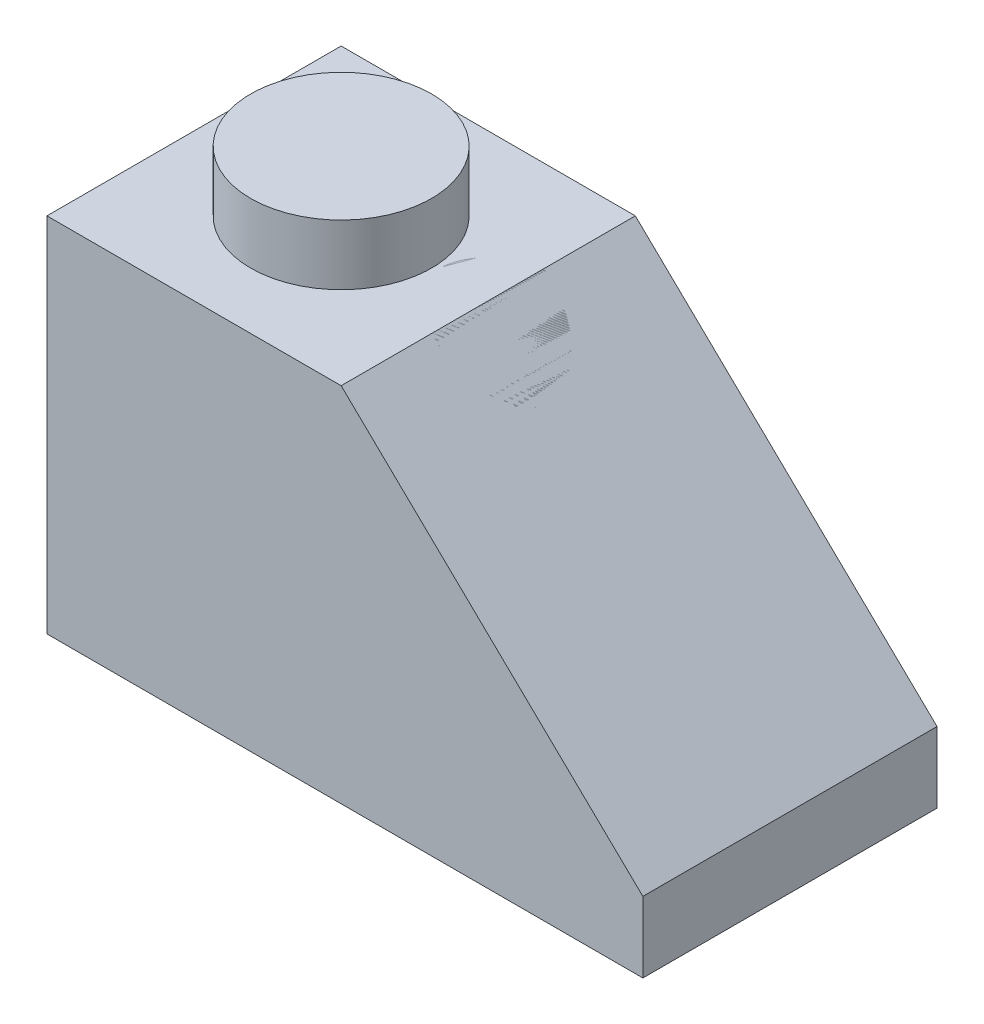
ISO-10303-21;
HEADER;
FILE_DESCRIPTION(('STEP AP214'),'2;1');
FILE_NAME('part.step','',(''),(''),'','','');
FILE_SCHEMA(('AUTOMOTIVE_DESIGN { 1 0 10303 214 1 1 1 1 }'));
ENDSEC;
DATA;
#1=APPLICATION_CONTEXT('core data for automotive mechanical design processes');
#2=APPLICATION_PROTOCOL_DEFINITION('international standard','automotive_design',2000,#1);
#3=PRODUCT_CONTEXT('',#1,'mechanical');
#4=PRODUCT('Part','Part','',(#3));
#5=PRODUCT_RELATED_PRODUCT_CATEGORY('part','',(#4));
#6=PRODUCT_DEFINITION_FORMATION('','',#4);
#7=PRODUCT_DEFINITION_CONTEXT('part definition',#1,'design');
#8=PRODUCT_DEFINITION('design','',#6,#7);
#9=PRODUCT_DEFINITION_SHAPE('','',#8);
#10=(LENGTH_UNIT() NAMED_UNIT(*) SI_UNIT(.MILLI.,.METRE.));
#11=(NAMED_UNIT(*) PLANE_ANGLE_UNIT() SI_UNIT($,.RADIAN.));
#12=(NAMED_UNIT(*) SI_UNIT($,.STERADIAN.) SOLID_ANGLE_UNIT());
#13=UNCERTAINTY_MEASURE_WITH_UNIT(LENGTH_MEASURE(1.E-05),#10,'distance_accuracy_value','');
#14=(GEOMETRIC_REPRESENTATION_CONTEXT(3) GLOBAL_UNCERTAINTY_ASSIGNED_CONTEXT((#13)) GLOBAL_UNIT_ASSIGNED_CONTEXT((#10,
#11,#12)) REPRESENTATION_CONTEXT('',''));
#15=CARTESIAN_POINT('',(0.,0.,0.));
#16=DIRECTION('',(0.,0.,1.));
#17=DIRECTION('',(1.,0.,0.));
#18=AXIS2_PLACEMENT_3D('',#15,#16,#17);
#19=CARTESIAN_POINT('',(0.,9.6,-7.8));
#20=DIRECTION('',(0.,-1.,0.));
#21=DIRECTION('',(0.,0.,-1.));
#22=AXIS2_PLACEMENT_3D('',#19,#20,#21);
#23=PLANE('',#22);
#24=DIRECTION('',(0.,0.,1.));
#25=VECTOR('',#24,1.);
#26=CARTESIAN_POINT('',(7.8,9.6,-7.8));
#27=LINE('',#26,#25);
#28=CARTESIAN_POINT('',(7.8,9.6,-5.39666295470958));
#29=VERTEX_POINT('',#28);
#30=CARTESIAN_POINT('',(7.8,9.6,-2.40333704529042));
#31=VERTEX_POINT('',#30);
#32=EDGE_CURVE('E12',#29,#31,#27,.T.);
#33=ORIENTED_EDGE('',*,*,#32,.F.);
#34=CARTESIAN_POINT('',(7.9,9.6,-3.9));
#35=DIRECTION('',(0.,-1.,0.));
#36=DIRECTION('',(0.,0.,-1.));
#37=AXIS2_PLACEMENT_3D('',#34,#35,#36);
#38=CIRCLE('',#37,1.5);
#39=EDGE_CURVE('E51',#29,#31,#38,.F.);
#40=ORIENTED_EDGE('',*,*,#39,.T.);
#41=EDGE_LOOP('',(#33,#40));
#42=FACE_BOUND('',#41,.T.);
#43=ADVANCED_FACE('F47',(#42),#23,.F.);
#44=CARTESIAN_POINT('',(7.8,9.6,-7.8));
#45=DIRECTION('',(-0.694658370458999,-0.71933980033865,0.));
#46=DIRECTION('',(0.71933980033865,-0.694658370458999,0.));
#47=AXIS2_PLACEMENT_3D('',#44,#45,#46);
#48=PLANE('',#47);
#49=ORIENTED_EDGE('',*,*,#32,.T.);
#50=CARTESIAN_POINT('',(7.9,9.50343112251929,-3.9));
#51=DIRECTION('',(-0.694658370458999,-0.71933980033865,0.));
#52=DIRECTION('',(0.71933980033865,-0.694658370458999,0.));
#53=AXIS2_PLACEMENT_3D('',#50,#51,#52);
#54=ELLIPSE('',#53,2.08524538652502,1.5);
#55=EDGE_CURVE('E67',#31,#29,#54,.F.);
#56=ORIENTED_EDGE('',*,*,#55,.T.);
#57=EDGE_LOOP('',(#49,#56));
#58=FACE_BOUND('',#57,.T.);
#59=ADVANCED_FACE('F65',(#58),#48,.F.);
#60=CARTESIAN_POINT('',(7.9,9.602,-3.9));
#61=DIRECTION('',(0.,-1.,0.));
#62=DIRECTION('',(0.,0.,-1.));
#63=AXIS2_PLACEMENT_3D('',#60,#61,#62);
#64=CYLINDRICAL_SURFACE('',#63,1.5);
#65=ORIENTED_EDGE('',*,*,#55,.F.);
#66=ORIENTED_EDGE('',*,*,#39,.F.);
#67=EDGE_LOOP('',(#65,#66));
#68=FACE_BOUND('',#67,.T.);
#69=CARTESIAN_POINT('',(7.9,0.2,-3.9));
#70=DIRECTION('',(0.,-1.,0.));
#71=DIRECTION('',(0.,0.,-1.));
#72=AXIS2_PLACEMENT_3D('',#69,#70,#71);
#73=CIRCLE('',#72,1.5);
#74=CARTESIAN_POINT('',(7.9,0.2,-5.4));
#75=VERTEX_POINT('',#74);
#76=EDGE_CURVE('E56',#75,#75,#73,.T.);
#77=ORIENTED_EDGE('',*,*,#76,.F.);
#78=EDGE_LOOP('',(#77));
#79=FACE_BOUND('',#78,.T.);
#80=ADVANCED_FACE('F49',(#68,#79),#64,.T.);
#81=CARTESIAN_POINT('',(7.9,0.2,-3.9));
#82=DIRECTION('',(0.,-1.,0.));
#83=DIRECTION('',(0.,0.,-1.));
#84=AXIS2_PLACEMENT_3D('',#81,#82,#83);
#85=PLANE('',#84);
#86=ORIENTED_EDGE('',*,*,#76,.T.);
#87=EDGE_LOOP('',(#86));
#88=FACE_BOUND('',#87,.T.);
#89=ADVANCED_FACE('F74',(#88),#85,.T.);
#90=CLOSED_SHELL('',(#43,#59,#80,#89));
#91=MANIFOLD_SOLID_BREP('B2',#90);
#92=CARTESIAN_POINT('',(0.,0.,-7.8));
#93=DIRECTION('',(0.,-1.,0.));
#94=DIRECTION('',(0.,0.,-1.));
#95=AXIS2_PLACEMENT_3D('',#92,#93,#94);
#96=PLANE('',#95);
#97=DIRECTION('',(1.,0.,0.));
#98=VECTOR('',#97,1.);
#99=CARTESIAN_POINT('',(0.,0.,0.));
#100=LINE('',#99,#98);
#101=CARTESIAN_POINT('',(0.,0.,0.));
#102=VERTEX_POINT('',#101);
#103=CARTESIAN_POINT('',(15.8,0.,0.));
#104=VERTEX_POINT('',#103);
#105=EDGE_CURVE('E201',#102,#104,#100,.T.);
#106=ORIENTED_EDGE('',*,*,#105,.F.);
#107=DIRECTION('',(0.,0.,1.));
#108=VECTOR('',#107,1.);
#109=CARTESIAN_POINT('',(0.,0.,-7.8));
#110=LINE('',#109,#108);
#111=CARTESIAN_POINT('',(0.,0.,-7.8));
#112=VERTEX_POINT('',#111);
#113=EDGE_CURVE('E116',#112,#102,#110,.T.);
#114=ORIENTED_EDGE('',*,*,#113,.F.);
#115=DIRECTION('',(1.,0.,0.));
#116=VECTOR('',#115,1.);
#117=CARTESIAN_POINT('',(0.,0.,-7.8));
#118=LINE('',#117,#116);
#119=CARTESIAN_POINT('',(15.8,0.,-7.8));
#120=VERTEX_POINT('',#119);
#121=EDGE_CURVE('E196',#112,#120,#118,.T.);
#122=ORIENTED_EDGE('',*,*,#121,.T.);
#123=DIRECTION('',(0.,0.,1.));
#124=VECTOR('',#123,1.);
#125=CARTESIAN_POINT('',(15.8,0.,-7.8));
#126=LINE('',#125,#124);
#127=EDGE_CURVE('E111',#120,#104,#126,.T.);
#128=ORIENTED_EDGE('',*,*,#127,.T.);
#129=EDGE_LOOP('',(#106,#114,#122,#128));
#130=FACE_BOUND('',#129,.T.);
#131=DIRECTION('',(0.,0.,1.));
#132=VECTOR('',#131,1.);
#133=CARTESIAN_POINT('',(1.2,0.,-7.8));
#134=LINE('',#133,#132);
#135=CARTESIAN_POINT('',(1.2,0.,-6.6));
#136=VERTEX_POINT('',#135);
#137=CARTESIAN_POINT('',(1.2,0.,-1.2));
#138=VERTEX_POINT('',#137);
#139=EDGE_CURVE('E236',#136,#138,#134,.T.);
#140=ORIENTED_EDGE('',*,*,#139,.T.);
#141=DIRECTION('',(1.,0.,0.));
#142=VECTOR('',#141,1.);
#143=CARTESIAN_POINT('',(0.,0.,-1.2));
#144=LINE('',#143,#142);
#145=CARTESIAN_POINT('',(14.6,0.,-1.2));
#146=VERTEX_POINT('',#145);
#147=EDGE_CURVE('E223',#138,#146,#144,.T.);
#148=ORIENTED_EDGE('',*,*,#147,.T.);
#149=DIRECTION('',(0.,0.,1.));
#150=VECTOR('',#149,1.);
#151=CARTESIAN_POINT('',(14.6,0.,-7.8));
#152=LINE('',#151,#150);
#153=CARTESIAN_POINT('',(14.6,0.,-6.6));
#154=VERTEX_POINT('',#153);
#155=EDGE_CURVE('E228',#154,#146,#152,.T.);
#156=ORIENTED_EDGE('',*,*,#155,.F.);
#157=DIRECTION('',(1.,0.,0.));
#158=VECTOR('',#157,1.);
#159=CARTESIAN_POINT('',(0.,0.,-6.6));
#160=LINE('',#159,#158);
#161=EDGE_CURVE('E124',#136,#154,#160,.T.);
#162=ORIENTED_EDGE('',*,*,#161,.F.);
#163=EDGE_LOOP('',(#140,#148,#156,#162));
#164=FACE_BOUND('',#163,.T.);
#165=ADVANCED_FACE('F108',(#130,#164),#96,.T.);
#166=CARTESIAN_POINT('',(0.,0.,-7.8));
#167=DIRECTION('',(1.,0.,0.));
#168=DIRECTION('',(0.,0.,-1.));
#169=AXIS2_PLACEMENT_3D('',#166,#167,#168);
#170=PLANE('',#169);
#171=DIRECTION('',(0.,1.,0.));
#172=VECTOR('',#171,1.);
#173=CARTESIAN_POINT('',(0.,0.,0.));
#174=LINE('',#173,#172);
#175=CARTESIAN_POINT('',(0.,9.6,0.));
#176=VERTEX_POINT('',#175);
#177=EDGE_CURVE('E211',#102,#176,#174,.T.);
#178=ORIENTED_EDGE('',*,*,#177,.T.);
#179=DIRECTION('',(0.,0.,1.));
#180=VECTOR('',#179,1.);
#181=CARTESIAN_POINT('',(0.,9.6,-7.8));
#182=LINE('',#181,#180);
#183=CARTESIAN_POINT('',(0.,9.6,-7.8));
#184=VERTEX_POINT('',#183);
#185=EDGE_CURVE('E190',#184,#176,#182,.T.);
#186=ORIENTED_EDGE('',*,*,#185,.F.);
#187=DIRECTION('',(0.,1.,0.));
#188=VECTOR('',#187,1.);
#189=CARTESIAN_POINT('',(0.,0.,-7.8));
#190=LINE('',#189,#188);
#191=EDGE_CURVE('E177',#112,#184,#190,.T.);
#192=ORIENTED_EDGE('',*,*,#191,.F.);
#193=ORIENTED_EDGE('',*,*,#113,.T.);
#194=EDGE_LOOP('',(#178,#186,#192,#193));
#195=FACE_BOUND('',#194,.T.);
#196=ADVANCED_FACE('F218',(#195),#170,.F.);
#197=CARTESIAN_POINT('',(0.,9.6,-7.8));
#198=DIRECTION('',(0.,-1.,0.));
#199=DIRECTION('',(0.,0.,-1.));
#200=AXIS2_PLACEMENT_3D('',#197,#198,#199);
#201=PLANE('',#200);
#202=CARTESIAN_POINT('',(3.9,9.6,-3.9));
#203=DIRECTION('',(0.,1.,0.));
#204=DIRECTION('',(0.,0.,1.));
#205=AXIS2_PLACEMENT_3D('',#202,#203,#204);
#206=CIRCLE('',#205,2.4);
#207=CARTESIAN_POINT('',(3.9,9.6,-1.5));
#208=VERTEX_POINT('',#207);
#209=EDGE_CURVE('E45',#208,#208,#206,.T.);
#210=ORIENTED_EDGE('',*,*,#209,.F.);
#211=EDGE_LOOP('',(#210));
#212=FACE_BOUND('',#211,.T.);
#213=DIRECTION('',(1.,0.,0.));
#214=VECTOR('',#213,1.);
#215=CARTESIAN_POINT('',(0.,9.6,0.));
#216=LINE('',#215,#214);
#217=CARTESIAN_POINT('',(7.8,9.6,0.));
#218=VERTEX_POINT('',#217);
#219=EDGE_CURVE('E186',#176,#218,#216,.T.);
#220=ORIENTED_EDGE('',*,*,#219,.T.);
#221=DIRECTION('',(0.,0.,1.));
#222=VECTOR('',#221,1.);
#223=CARTESIAN_POINT('',(7.8,9.6,-7.8));
#224=LINE('',#223,#222);
#225=CARTESIAN_POINT('',(7.8,9.6,-7.8));
#226=VERTEX_POINT('',#225);
#227=EDGE_CURVE('E183',#226,#218,#224,.T.);
#228=ORIENTED_EDGE('',*,*,#227,.F.);
#229=DIRECTION('',(1.,0.,0.));
#230=VECTOR('',#229,1.);
#231=CARTESIAN_POINT('',(0.,9.6,-7.8));
#232=LINE('',#231,#230);
#233=EDGE_CURVE('E170',#184,#226,#232,.T.);
#234=ORIENTED_EDGE('',*,*,#233,.F.);
#235=ORIENTED_EDGE('',*,*,#185,.T.);
#236=EDGE_LOOP('',(#220,#228,#234,#235));
#237=FACE_BOUND('',#236,.T.);
#238=ADVANCED_FACE('F184',(#212,#237),#201,.F.);
#239=CARTESIAN_POINT('',(7.8,9.6,-7.8));
#240=DIRECTION('',(-0.694658370458999,-0.71933980033865,0.));
#241=DIRECTION('',(0.71933980033865,-0.694658370458999,0.));
#242=AXIS2_PLACEMENT_3D('',#239,#240,#241);
#243=PLANE('',#242);
#244=DIRECTION('',(0.71933980033865,-0.694658370458999,0.));
#245=VECTOR('',#244,1.);
#246=CARTESIAN_POINT('',(7.8,9.6,0.));
#247=LINE('',#246,#245);
#248=CARTESIAN_POINT('',(15.8,1.87448980154338,0.));
#249=VERTEX_POINT('',#248);
#250=EDGE_CURVE('E208',#218,#249,#247,.T.);
#251=ORIENTED_EDGE('',*,*,#250,.T.);
#252=DIRECTION('',(0.,0.,1.));
#253=VECTOR('',#252,1.);
#254=CARTESIAN_POINT('',(15.8,1.87448980154338,-7.8));
#255=LINE('',#254,#253);
#256=CARTESIAN_POINT('',(15.8,1.87448980154338,-7.8));
#257=VERTEX_POINT('',#256);
#258=EDGE_CURVE('E191',#257,#249,#255,.T.);
#259=ORIENTED_EDGE('',*,*,#258,.F.);
#260=DIRECTION('',(0.71933980033865,-0.694658370458999,0.));
#261=VECTOR('',#260,1.);
#262=CARTESIAN_POINT('',(7.8,9.6,-7.8));
#263=LINE('',#262,#261);
#264=EDGE_CURVE('E175',#226,#257,#263,.T.);
#265=ORIENTED_EDGE('',*,*,#264,.F.);
#266=ORIENTED_EDGE('',*,*,#227,.T.);
#267=EDGE_LOOP('',(#251,#259,#265,#266));
#268=FACE_BOUND('',#267,.T.);
#269=ADVANCED_FACE('F193',(#268),#243,.F.);
#270=CARTESIAN_POINT('',(15.8,0.,-7.8));
#271=DIRECTION('',(1.,0.,0.));
#272=DIRECTION('',(0.,0.,-1.));
#273=AXIS2_PLACEMENT_3D('',#270,#271,#272);
#274=PLANE('',#273);
#275=DIRECTION('',(0.,1.,0.));
#276=VECTOR('',#275,1.);
#277=CARTESIAN_POINT('',(15.8,0.,0.));
#278=LINE('',#277,#276);
#279=EDGE_CURVE('E204',#104,#249,#278,.T.);
#280=ORIENTED_EDGE('',*,*,#279,.F.);
#281=ORIENTED_EDGE('',*,*,#127,.F.);
#282=DIRECTION('',(0.,1.,0.));
#283=VECTOR('',#282,1.);
#284=CARTESIAN_POINT('',(15.8,0.,-7.8));
#285=LINE('',#284,#283);
#286=EDGE_CURVE('E194',#120,#257,#285,.T.);
#287=ORIENTED_EDGE('',*,*,#286,.T.);
#288=ORIENTED_EDGE('',*,*,#258,.T.);
#289=EDGE_LOOP('',(#280,#281,#287,#288));
#290=FACE_BOUND('',#289,.T.);
#291=ADVANCED_FACE('F215',(#290),#274,.T.);
#292=CARTESIAN_POINT('',(0.,0.,-7.8));
#293=DIRECTION('',(0.,0.,1.));
#294=DIRECTION('',(1.,0.,0.));
#295=AXIS2_PLACEMENT_3D('',#292,#293,#294);
#296=PLANE('',#295);
#297=ORIENTED_EDGE('',*,*,#121,.F.);
#298=ORIENTED_EDGE('',*,*,#191,.T.);
#299=ORIENTED_EDGE('',*,*,#233,.T.);
#300=ORIENTED_EDGE('',*,*,#264,.T.);
#301=ORIENTED_EDGE('',*,*,#286,.F.);
#302=EDGE_LOOP('',(#297,#298,#299,#300,#301));
#303=FACE_BOUND('',#302,.T.);
#304=ADVANCED_FACE('F173',(#303),#296,.F.);
#305=CARTESIAN_POINT('',(0.,0.,0.));
#306=DIRECTION('',(0.,0.,1.));
#307=DIRECTION('',(1.,0.,0.));
#308=AXIS2_PLACEMENT_3D('',#305,#306,#307);
#309=PLANE('',#308);
#310=ORIENTED_EDGE('',*,*,#105,.T.);
#311=ORIENTED_EDGE('',*,*,#279,.T.);
#312=ORIENTED_EDGE('',*,*,#250,.F.);
#313=ORIENTED_EDGE('',*,*,#219,.F.);
#314=ORIENTED_EDGE('',*,*,#177,.F.);
#315=EDGE_LOOP('',(#310,#311,#312,#313,#314));
#316=FACE_BOUND('',#315,.T.);
#317=ADVANCED_FACE('F217',(#316),#309,.T.);
#318=CARTESIAN_POINT('',(3.9,11.2,-3.9));
#319=DIRECTION('',(0.,-1.,0.));
#320=DIRECTION('',(0.,0.,-1.));
#321=AXIS2_PLACEMENT_3D('',#318,#319,#320);
#322=CYLINDRICAL_SURFACE('',#321,2.4);
#323=CARTESIAN_POINT('',(3.9,11.2,-3.9));
#324=DIRECTION('',(0.,1.,0.));
#325=DIRECTION('',(0.,0.,1.));
#326=AXIS2_PLACEMENT_3D('',#323,#324,#325);
#327=CIRCLE('',#326,2.4);
#328=CARTESIAN_POINT('',(3.9,11.2,-1.5));
#329=VERTEX_POINT('',#328);
#330=EDGE_CURVE('E205',#329,#329,#327,.T.);
#331=ORIENTED_EDGE('',*,*,#330,.F.);
#332=EDGE_LOOP('',(#331));
#333=FACE_BOUND('',#332,.T.);
#334=ORIENTED_EDGE('',*,*,#209,.T.);
#335=EDGE_LOOP('',(#334));
#336=FACE_BOUND('',#335,.T.);
#337=ADVANCED_FACE('F336',(#333,#336),#322,.T.);
#338=CARTESIAN_POINT('',(3.9,11.2,-3.9));
#339=DIRECTION('',(0.,1.,0.));
#340=DIRECTION('',(0.,0.,1.));
#341=AXIS2_PLACEMENT_3D('',#338,#339,#340);
#342=PLANE('',#341);
#343=ORIENTED_EDGE('',*,*,#330,.T.);
#344=EDGE_LOOP('',(#343));
#345=FACE_BOUND('',#344,.T.);
#346=ADVANCED_FACE('F340',(#345),#342,.T.);
#347=CARTESIAN_POINT('',(1.2,0.,-7.8));
#348=DIRECTION('',(1.,0.,0.));
#349=DIRECTION('',(0.,0.,-1.));
#350=AXIS2_PLACEMENT_3D('',#347,#348,#349);
#351=PLANE('',#350);
#352=DIRECTION('',(0.,1.,0.));
#353=VECTOR('',#352,1.);
#354=CARTESIAN_POINT('',(1.2,0.,-1.2));
#355=LINE('',#354,#353);
#356=CARTESIAN_POINT('',(1.2,8.4,-1.2));
#357=VERTEX_POINT('',#356);
#358=EDGE_CURVE('E235',#138,#357,#355,.T.);
#359=ORIENTED_EDGE('',*,*,#358,.F.);
#360=ORIENTED_EDGE('',*,*,#139,.F.);
#361=DIRECTION('',(0.,1.,0.));
#362=VECTOR('',#361,1.);
#363=CARTESIAN_POINT('',(1.2,0.,-6.6));
#364=LINE('',#363,#362);
#365=CARTESIAN_POINT('',(1.2,8.4,-6.6));
#366=VERTEX_POINT('',#365);
#367=EDGE_CURVE('E232',#136,#366,#364,.T.);
#368=ORIENTED_EDGE('',*,*,#367,.T.);
#369=DIRECTION('',(0.,0.,1.));
#370=VECTOR('',#369,1.);
#371=CARTESIAN_POINT('',(1.2,8.4,-7.8));
#372=LINE('',#371,#370);
#373=EDGE_CURVE('E239',#366,#357,#372,.T.);
#374=ORIENTED_EDGE('',*,*,#373,.T.);
#375=EDGE_LOOP('',(#359,#360,#368,#374));
#376=FACE_BOUND('',#375,.T.);
#377=ADVANCED_FACE('F281',(#376),#351,.T.);
#378=CARTESIAN_POINT('',(0.,8.4,-7.8));
#379=DIRECTION('',(0.,-1.,0.));
#380=DIRECTION('',(0.,0.,-1.));
#381=AXIS2_PLACEMENT_3D('',#378,#379,#380);
#382=PLANE('',#381);
#383=CARTESIAN_POINT('',(3.9,8.4,-3.9));
#384=DIRECTION('',(0.,-1.,0.));
#385=DIRECTION('',(0.,0.,-1.));
#386=AXIS2_PLACEMENT_3D('',#383,#384,#385);
#387=CIRCLE('',#386,1.2);
#388=CARTESIAN_POINT('',(3.9,8.4,-5.1));
#389=VERTEX_POINT('',#388);
#390=EDGE_CURVE('E222',#389,#389,#387,.F.);
#391=ORIENTED_EDGE('',*,*,#390,.T.);
#392=EDGE_LOOP('',(#391));
#393=FACE_BOUND('',#392,.T.);
#394=DIRECTION('',(1.,0.,0.));
#395=VECTOR('',#394,1.);
#396=CARTESIAN_POINT('',(0.,8.4,-1.2));
#397=LINE('',#396,#395);
#398=CARTESIAN_POINT('',(7.31516852899781,8.4,-1.2));
#399=VERTEX_POINT('',#398);
#400=EDGE_CURVE('E255',#357,#399,#397,.T.);
#401=ORIENTED_EDGE('',*,*,#400,.F.);
#402=ORIENTED_EDGE('',*,*,#373,.F.);
#403=DIRECTION('',(1.,0.,0.));
#404=VECTOR('',#403,1.);
#405=CARTESIAN_POINT('',(0.,8.4,-6.6));
#406=LINE('',#405,#404);
#407=CARTESIAN_POINT('',(7.31516852899781,8.4,-6.6));
#408=VERTEX_POINT('',#407);
#409=EDGE_CURVE('E249',#366,#408,#406,.T.);
#410=ORIENTED_EDGE('',*,*,#409,.T.);
#411=DIRECTION('',(0.,0.,1.));
#412=VECTOR('',#411,1.);
#413=CARTESIAN_POINT('',(7.31516852899781,8.4,-7.8));
#414=LINE('',#413,#412);
#415=EDGE_CURVE('E252',#408,#399,#414,.T.);
#416=ORIENTED_EDGE('',*,*,#415,.T.);
#417=EDGE_LOOP('',(#401,#402,#410,#416));
#418=FACE_BOUND('',#417,.T.);
#419=ADVANCED_FACE('F285',(#393,#418),#382,.T.);
#420=CARTESIAN_POINT('',(6.9664099554492,8.73679223959362,-7.8));
#421=DIRECTION('',(-0.694658370458999,-0.71933980033865,0.));
#422=DIRECTION('',(0.71933980033865,-0.694658370458999,0.));
#423=AXIS2_PLACEMENT_3D('',#420,#421,#422);
#424=PLANE('',#423);
#425=DIRECTION('',(0.71933980033865,-0.694658370458999,0.));
#426=VECTOR('',#425,1.);
#427=CARTESIAN_POINT('',(7.72737788800112,8.00193404914008,-1.2));
#428=LINE('',#427,#426);
#429=CARTESIAN_POINT('',(14.6,1.36512002209185,-1.2));
#430=VERTEX_POINT('',#429);
#431=EDGE_CURVE('E246',#399,#430,#428,.T.);
#432=ORIENTED_EDGE('',*,*,#431,.F.);
#433=ORIENTED_EDGE('',*,*,#415,.F.);
#434=DIRECTION('',(0.71933980033865,-0.694658370458999,0.));
#435=VECTOR('',#434,1.);
#436=CARTESIAN_POINT('',(7.72737788800112,8.00193404914008,-6.6));
#437=LINE('',#436,#435);
#438=CARTESIAN_POINT('',(14.6,1.36512002209185,-6.6));
#439=VERTEX_POINT('',#438);
#440=EDGE_CURVE('E243',#408,#439,#437,.T.);
#441=ORIENTED_EDGE('',*,*,#440,.T.);
#442=DIRECTION('',(0.,0.,1.));
#443=VECTOR('',#442,1.);
#444=CARTESIAN_POINT('',(14.6,1.36512002209185,-7.8));
#445=LINE('',#444,#443);
#446=EDGE_CURVE('E231',#439,#430,#445,.T.);
#447=ORIENTED_EDGE('',*,*,#446,.T.);
#448=EDGE_LOOP('',(#432,#433,#441,#447));
#449=FACE_BOUND('',#448,.T.);
#450=ADVANCED_FACE('F293',(#449),#424,.T.);
#451=CARTESIAN_POINT('',(14.6,0.,-7.8));
#452=DIRECTION('',(1.,0.,0.));
#453=DIRECTION('',(0.,0.,-1.));
#454=AXIS2_PLACEMENT_3D('',#451,#452,#453);
#455=PLANE('',#454);
#456=DIRECTION('',(0.,1.,0.));
#457=VECTOR('',#456,1.);
#458=CARTESIAN_POINT('',(14.6,0.,-1.2));
#459=LINE('',#458,#457);
#460=EDGE_CURVE('E226',#146,#430,#459,.T.);
#461=ORIENTED_EDGE('',*,*,#460,.T.);
#462=ORIENTED_EDGE('',*,*,#446,.F.);
#463=DIRECTION('',(0.,1.,0.));
#464=VECTOR('',#463,1.);
#465=CARTESIAN_POINT('',(14.6,0.,-6.6));
#466=LINE('',#465,#464);
#467=EDGE_CURVE('E234',#154,#439,#466,.T.);
#468=ORIENTED_EDGE('',*,*,#467,.F.);
#469=ORIENTED_EDGE('',*,*,#155,.T.);
#470=EDGE_LOOP('',(#461,#462,#468,#469));
#471=FACE_BOUND('',#470,.T.);
#472=ADVANCED_FACE('F298',(#471),#455,.F.);
#473=CARTESIAN_POINT('',(0.,0.,-6.6));
#474=DIRECTION('',(0.,0.,1.));
#475=DIRECTION('',(1.,0.,0.));
#476=AXIS2_PLACEMENT_3D('',#473,#474,#475);
#477=PLANE('',#476);
#478=ORIENTED_EDGE('',*,*,#161,.T.);
#479=ORIENTED_EDGE('',*,*,#467,.T.);
#480=ORIENTED_EDGE('',*,*,#440,.F.);
#481=ORIENTED_EDGE('',*,*,#409,.F.);
#482=ORIENTED_EDGE('',*,*,#367,.F.);
#483=EDGE_LOOP('',(#478,#479,#480,#481,#482));
#484=FACE_BOUND('',#483,.T.);
#485=ADVANCED_FACE('F302',(#484),#477,.T.);
#486=CARTESIAN_POINT('',(0.,0.,-1.2));
#487=DIRECTION('',(0.,0.,1.));
#488=DIRECTION('',(1.,0.,0.));
#489=AXIS2_PLACEMENT_3D('',#486,#487,#488);
#490=PLANE('',#489);
#491=ORIENTED_EDGE('',*,*,#147,.F.);
#492=ORIENTED_EDGE('',*,*,#358,.T.);
#493=ORIENTED_EDGE('',*,*,#400,.T.);
#494=ORIENTED_EDGE('',*,*,#431,.T.);
#495=ORIENTED_EDGE('',*,*,#460,.F.);
#496=EDGE_LOOP('',(#491,#492,#493,#494,#495));
#497=FACE_BOUND('',#496,.T.);
#498=ADVANCED_FACE('F273',(#497),#490,.F.);
#499=CARTESIAN_POINT('',(3.9,11.2,-3.9));
#500=DIRECTION('',(0.,-1.,0.));
#501=DIRECTION('',(0.,0.,-1.));
#502=AXIS2_PLACEMENT_3D('',#499,#500,#501);
#503=CYLINDRICAL_SURFACE('',#502,1.2);
#504=CARTESIAN_POINT('',(3.9,10.,-3.9));
#505=DIRECTION('',(0.,1.,0.));
#506=DIRECTION('',(0.,0.,1.));
#507=AXIS2_PLACEMENT_3D('',#504,#505,#506);
#508=CIRCLE('',#507,1.2);
#509=CARTESIAN_POINT('',(3.9,10.,-2.7));
#510=VERTEX_POINT('',#509);
#511=EDGE_CURVE('E227',#510,#510,#508,.T.);
#512=ORIENTED_EDGE('',*,*,#511,.T.);
#513=EDGE_LOOP('',(#512));
#514=FACE_BOUND('',#513,.T.);
#515=ORIENTED_EDGE('',*,*,#390,.F.);
#516=EDGE_LOOP('',(#515));
#517=FACE_BOUND('',#516,.T.);
#518=ADVANCED_FACE('F312',(#514,#517),#503,.F.);
#519=CARTESIAN_POINT('',(3.9,10.,-3.9));
#520=DIRECTION('',(0.,1.,0.));
#521=DIRECTION('',(0.,0.,1.));
#522=AXIS2_PLACEMENT_3D('',#519,#520,#521);
#523=PLANE('',#522);
#524=ORIENTED_EDGE('',*,*,#511,.F.);
#525=EDGE_LOOP('',(#524));
#526=FACE_BOUND('',#525,.T.);
#527=ADVANCED_FACE('F345',(#526),#523,.F.);
#528=CLOSED_SHELL('',(#165,#196,#238,#269,#291,#304,#317,#337,#346,#377,#419,#450,#472,#485,
#498,#518,#527));
#529=MANIFOLD_SOLID_BREP('B6',#528);
#530=ADVANCED_BREP_SHAPE_REPRESENTATION('',(#18,#91,#529),#14);
#531=SHAPE_DEFINITION_REPRESENTATION(#9,#530);
ENDSEC;
END-ISO-10303-21;
